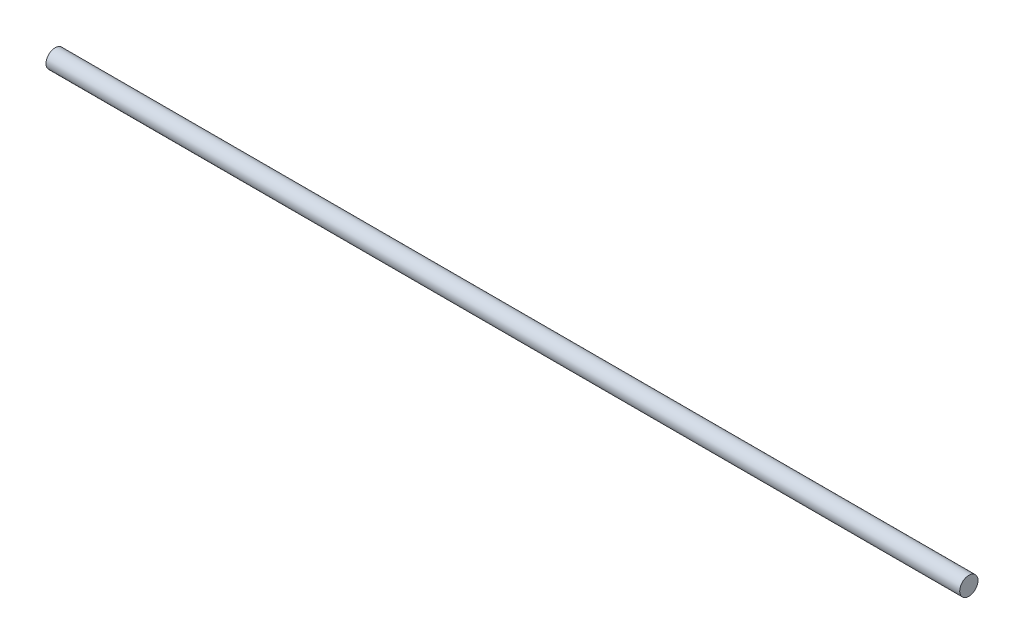
ISO-10303-21;
HEADER;
FILE_DESCRIPTION(('STEP AP214'),'2;1');
FILE_NAME('part.step','',(''),(''),'','','');
FILE_SCHEMA(('AUTOMOTIVE_DESIGN { 1 0 10303 214 1 1 1 1 }'));
ENDSEC;
DATA;
#1=APPLICATION_CONTEXT('core data for automotive mechanical design processes');
#2=APPLICATION_PROTOCOL_DEFINITION('international standard','automotive_design',2000,#1);
#3=PRODUCT_CONTEXT('',#1,'mechanical');
#4=PRODUCT('Part','Part','',(#3));
#5=PRODUCT_RELATED_PRODUCT_CATEGORY('part','',(#4));
#6=PRODUCT_DEFINITION_FORMATION('','',#4);
#7=PRODUCT_DEFINITION_CONTEXT('part definition',#1,'design');
#8=PRODUCT_DEFINITION('design','',#6,#7);
#9=PRODUCT_DEFINITION_SHAPE('','',#8);
#10=(LENGTH_UNIT() NAMED_UNIT(*) SI_UNIT(.MILLI.,.METRE.));
#11=(NAMED_UNIT(*) PLANE_ANGLE_UNIT() SI_UNIT($,.RADIAN.));
#12=(NAMED_UNIT(*) SI_UNIT($,.STERADIAN.) SOLID_ANGLE_UNIT());
#13=UNCERTAINTY_MEASURE_WITH_UNIT(LENGTH_MEASURE(1.E-05),#10,'distance_accuracy_value','');
#14=(GEOMETRIC_REPRESENTATION_CONTEXT(3) GLOBAL_UNCERTAINTY_ASSIGNED_CONTEXT((#13)) GLOBAL_UNIT_ASSIGNED_CONTEXT((#10,
#11,#12)) REPRESENTATION_CONTEXT('',''));
#15=CARTESIAN_POINT('',(0.,0.,0.));
#16=DIRECTION('',(0.,0.,1.));
#17=DIRECTION('',(1.,0.,0.));
#18=AXIS2_PLACEMENT_3D('',#15,#16,#17);
#19=CARTESIAN_POINT('',(400.,0.,0.));
#20=DIRECTION('',(-1.,0.,0.));
#21=DIRECTION('',(0.,0.,1.));
#22=AXIS2_PLACEMENT_3D('',#19,#20,#21);
#23=CYLINDRICAL_SURFACE('',#22,4.);
#24=CARTESIAN_POINT('',(400.,0.,0.));
#25=DIRECTION('',(1.,0.,0.));
#26=DIRECTION('',(0.,0.,-1.));
#27=AXIS2_PLACEMENT_3D('',#24,#25,#26);
#28=CIRCLE('',#27,4.);
#29=CARTESIAN_POINT('',(400.,0.,-4.));
#30=VERTEX_POINT('',#29);
#31=EDGE_CURVE('E10',#30,#30,#28,.T.);
#32=ORIENTED_EDGE('',*,*,#31,.F.);
#33=EDGE_LOOP('',(#32));
#34=FACE_BOUND('',#33,.T.);
#35=CARTESIAN_POINT('',(0.,0.,0.));
#36=DIRECTION('',(1.,0.,0.));
#37=DIRECTION('',(0.,0.,-1.));
#38=AXIS2_PLACEMENT_3D('',#35,#36,#37);
#39=CIRCLE('',#38,4.);
#40=CARTESIAN_POINT('',(0.,0.,-4.));
#41=VERTEX_POINT('',#40);
#42=EDGE_CURVE('E35',#41,#41,#39,.T.);
#43=ORIENTED_EDGE('',*,*,#42,.T.);
#44=EDGE_LOOP('',(#43));
#45=FACE_BOUND('',#44,.T.);
#46=ADVANCED_FACE('F32',(#34,#45),#23,.T.);
#47=CARTESIAN_POINT('',(400.,0.,0.));
#48=DIRECTION('',(1.,0.,0.));
#49=DIRECTION('',(0.,0.,-1.));
#50=AXIS2_PLACEMENT_3D('',#47,#48,#49);
#51=PLANE('',#50);
#52=ORIENTED_EDGE('',*,*,#31,.T.);
#53=EDGE_LOOP('',(#52));
#54=FACE_BOUND('',#53,.T.);
#55=ADVANCED_FACE('F47',(#54),#51,.T.);
#56=CARTESIAN_POINT('',(0.,0.,0.));
#57=DIRECTION('',(1.,0.,0.));
#58=DIRECTION('',(0.,0.,-1.));
#59=AXIS2_PLACEMENT_3D('',#56,#57,#58);
#60=PLANE('',#59);
#61=ORIENTED_EDGE('',*,*,#42,.F.);
#62=EDGE_LOOP('',(#61));
#63=FACE_BOUND('',#62,.T.);
#64=ADVANCED_FACE('F45',(#63),#60,.F.);
#65=CLOSED_SHELL('',(#46,#55,#64));
#66=MANIFOLD_SOLID_BREP('B2',#65);
#67=ADVANCED_BREP_SHAPE_REPRESENTATION('',(#18,#66),#14);
#68=SHAPE_DEFINITION_REPRESENTATION(#9,#67);
ENDSEC;
END-ISO-10303-21;
